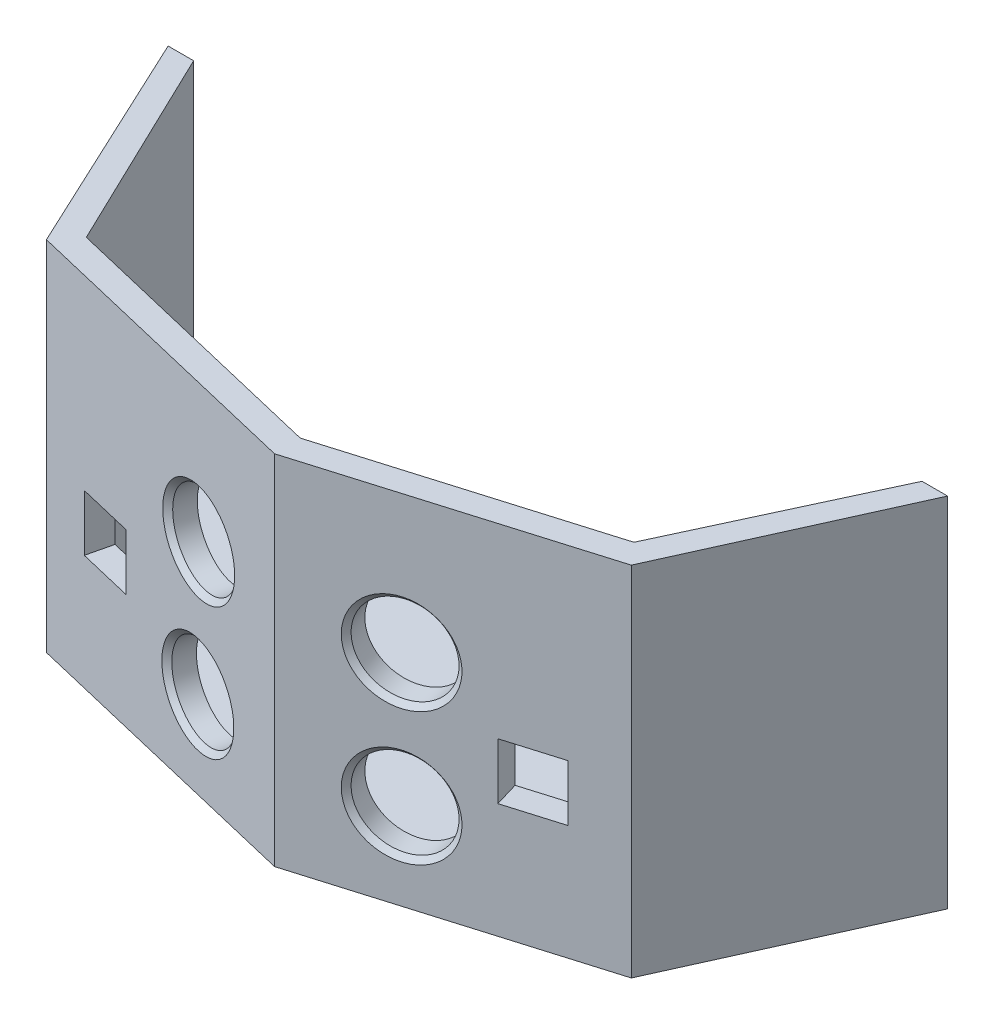
ISO-10303-21;
HEADER;
FILE_DESCRIPTION(('STEP AP214'),'2;1');
FILE_NAME('part.step','',(''),(''),'','','');
FILE_SCHEMA(('AUTOMOTIVE_DESIGN { 1 0 10303 214 1 1 1 1 }'));
ENDSEC;
DATA;
#1=APPLICATION_CONTEXT('core data for automotive mechanical design processes');
#2=APPLICATION_PROTOCOL_DEFINITION('international standard','automotive_design',2000,#1);
#3=PRODUCT_CONTEXT('',#1,'mechanical');
#4=PRODUCT('Part','Part','',(#3));
#5=PRODUCT_RELATED_PRODUCT_CATEGORY('part','',(#4));
#6=PRODUCT_DEFINITION_FORMATION('','',#4);
#7=PRODUCT_DEFINITION_CONTEXT('part definition',#1,'design');
#8=PRODUCT_DEFINITION('design','',#6,#7);
#9=PRODUCT_DEFINITION_SHAPE('','',#8);
#10=(LENGTH_UNIT() NAMED_UNIT(*) SI_UNIT(.MILLI.,.METRE.));
#11=(NAMED_UNIT(*) PLANE_ANGLE_UNIT() SI_UNIT($,.RADIAN.));
#12=(NAMED_UNIT(*) SI_UNIT($,.STERADIAN.) SOLID_ANGLE_UNIT());
#13=UNCERTAINTY_MEASURE_WITH_UNIT(LENGTH_MEASURE(1.E-05),#10,'distance_accuracy_value','');
#14=(GEOMETRIC_REPRESENTATION_CONTEXT(3) GLOBAL_UNCERTAINTY_ASSIGNED_CONTEXT((#13)) GLOBAL_UNIT_ASSIGNED_CONTEXT((#10,
#11,#12)) REPRESENTATION_CONTEXT('',''));
#15=CARTESIAN_POINT('',(0.,0.,0.));
#16=DIRECTION('',(0.,0.,1.));
#17=DIRECTION('',(1.,0.,0.));
#18=AXIS2_PLACEMENT_3D('',#15,#16,#17);
#19=CARTESIAN_POINT('',(-76.3,70.,57.7350269189626));
#20=DIRECTION('',(0.,0.,1.));
#21=DIRECTION('',(1.,0.,0.));
#22=AXIS2_PLACEMENT_3D('',#19,#20,#21);
#23=PLANE('',#22);
#24=CARTESIAN_POINT('',(0.,9.00000000000001,57.7350269189626));
#25=DIRECTION('',(0.,0.,-1.));
#26=DIRECTION('',(-1.,0.,0.));
#27=AXIS2_PLACEMENT_3D('',#24,#25,#26);
#28=CIRCLE('',#27,2.48490263839926);
#29=CARTESIAN_POINT('',(-2.48490263839926,9.00000000000001,57.7350269189626));
#30=VERTEX_POINT('',#29);
#31=EDGE_CURVE('E893',#30,#30,#28,.T.);
#32=ORIENTED_EDGE('',*,*,#31,.F.);
#33=EDGE_LOOP('',(#32));
#34=FACE_BOUND('',#33,.T.);
#35=DIRECTION('',(-1.,0.,0.));
#36=VECTOR('',#35,1.);
#37=CARTESIAN_POINT('',(-71.3,5.,57.7350269189626));
#38=LINE('',#37,#36);
#39=CARTESIAN_POINT('',(-11.3321595661992,5.,57.7350269189626));
#40=VERTEX_POINT('',#39);
#41=CARTESIAN_POINT('',(-71.3,5.,57.7350269189626));
#42=VERTEX_POINT('',#41);
#43=EDGE_CURVE('E261',#40,#42,#38,.T.);
#44=ORIENTED_EDGE('',*,*,#43,.F.);
#45=CARTESIAN_POINT('',(-11.3321595661992,8.99999999999998,57.7350269189626));
#46=DIRECTION('',(0.,0.,1.));
#47=DIRECTION('',(1.,0.,0.));
#48=AXIS2_PLACEMENT_3D('',#45,#46,#47);
#49=CIRCLE('',#48,4.);
#50=CARTESIAN_POINT('',(-7.38810637746616,8.33333333333332,57.7350269189626));
#51=VERTEX_POINT('',#50);
#52=EDGE_CURVE('E404',#40,#51,#49,.T.);
#53=ORIENTED_EDGE('',*,*,#52,.T.);
#54=CARTESIAN_POINT('',(0.500000000000002,7.,57.7350269189626));
#55=DIRECTION('',(0.,0.,1.));
#56=DIRECTION('',(1.,0.,0.));
#57=AXIS2_PLACEMENT_3D('',#54,#55,#56);
#58=CIRCLE('',#57,8.);
#59=CARTESIAN_POINT('',(0.,14.9843597113357,57.7350269189626));
#60=VERTEX_POINT('',#59);
#61=EDGE_CURVE('E383',#51,#60,#58,.F.);
#62=ORIENTED_EDGE('',*,*,#61,.T.);
#63=CARTESIAN_POINT('',(-0.499999999999999,7.,57.7350269189626));
#64=DIRECTION('',(0.,0.,1.));
#65=DIRECTION('',(1.,0.,0.));
#66=AXIS2_PLACEMENT_3D('',#63,#64,#65);
#67=CIRCLE('',#66,8.);
#68=CARTESIAN_POINT('',(7.38810637746616,8.33333333333332,57.7350269189626));
#69=VERTEX_POINT('',#68);
#70=EDGE_CURVE('E380',#60,#69,#67,.F.);
#71=ORIENTED_EDGE('',*,*,#70,.T.);
#72=CARTESIAN_POINT('',(11.3321595661992,8.99999999999998,57.7350269189626));
#73=DIRECTION('',(0.,0.,1.));
#74=DIRECTION('',(1.,0.,0.));
#75=AXIS2_PLACEMENT_3D('',#72,#73,#74);
#76=CIRCLE('',#75,4.);
#77=CARTESIAN_POINT('',(11.3321595661992,5.,57.7350269189626));
#78=VERTEX_POINT('',#77);
#79=EDGE_CURVE('E47',#69,#78,#76,.T.);
#80=ORIENTED_EDGE('',*,*,#79,.T.);
#81=CARTESIAN_POINT('',(71.3,5.,57.7350269189626));
#82=VERTEX_POINT('',#81);
#83=EDGE_CURVE('E262',#82,#78,#38,.T.);
#84=ORIENTED_EDGE('',*,*,#83,.F.);
#85=DIRECTION('',(0.,1.,0.));
#86=VECTOR('',#85,1.);
#87=CARTESIAN_POINT('',(71.3,5.,57.7350269189626));
#88=LINE('',#87,#86);
#89=CARTESIAN_POINT('',(71.3,70.,57.7350269189626));
#90=VERTEX_POINT('',#89);
#91=EDGE_CURVE('E279',#82,#90,#88,.T.);
#92=ORIENTED_EDGE('',*,*,#91,.T.);
#93=DIRECTION('',(-1.,0.,0.));
#94=VECTOR('',#93,1.);
#95=CARTESIAN_POINT('',(-76.3,70.,57.7350269189626));
#96=LINE('',#95,#94);
#97=CARTESIAN_POINT('',(76.3,70.,57.7350269189626));
#98=VERTEX_POINT('',#97);
#99=EDGE_CURVE('E288',#98,#90,#96,.T.);
#100=ORIENTED_EDGE('',*,*,#99,.F.);
#101=DIRECTION('',(0.,-1.,0.));
#102=VECTOR('',#101,1.);
#103=CARTESIAN_POINT('',(76.3,70.,57.7350269189626));
#104=LINE('',#103,#102);
#105=CARTESIAN_POINT('',(76.3,0.,57.7350269189626));
#106=VERTEX_POINT('',#105);
#107=EDGE_CURVE('E300',#98,#106,#104,.T.);
#108=ORIENTED_EDGE('',*,*,#107,.T.);
#109=DIRECTION('',(-1.,0.,0.));
#110=VECTOR('',#109,1.);
#111=CARTESIAN_POINT('',(-76.3,0.,57.7350269189626));
#112=LINE('',#111,#110);
#113=CARTESIAN_POINT('',(-76.3,0.,57.7350269189626));
#114=VERTEX_POINT('',#113);
#115=EDGE_CURVE('E278',#106,#114,#112,.T.);
#116=ORIENTED_EDGE('',*,*,#115,.T.);
#117=DIRECTION('',(0.,-1.,0.));
#118=VECTOR('',#117,1.);
#119=CARTESIAN_POINT('',(-76.3,70.,57.7350269189626));
#120=LINE('',#119,#118);
#121=CARTESIAN_POINT('',(-76.3,70.,57.7350269189626));
#122=VERTEX_POINT('',#121);
#123=EDGE_CURVE('E322',#122,#114,#120,.T.);
#124=ORIENTED_EDGE('',*,*,#123,.F.);
#125=CARTESIAN_POINT('',(-71.3,70.,57.7350269189626));
#126=VERTEX_POINT('',#125);
#127=EDGE_CURVE('E292',#126,#122,#96,.T.);
#128=ORIENTED_EDGE('',*,*,#127,.F.);
#129=DIRECTION('',(0.,1.,0.));
#130=VECTOR('',#129,1.);
#131=CARTESIAN_POINT('',(-71.3,5.,57.7350269189626));
#132=LINE('',#131,#130);
#133=EDGE_CURVE('E276',#42,#126,#132,.T.);
#134=ORIENTED_EDGE('',*,*,#133,.F.);
#135=EDGE_LOOP('',(#44,#53,#62,#71,#80,#84,#92,#100,#108,#116,#124,#128,#134));
#136=FACE_BOUND('',#135,.T.);
#137=ADVANCED_FACE('F38',(#34,#136),#23,.F.);
#138=CARTESIAN_POINT('',(-55.3740303304235,70.,102.482648944706));
#139=DIRECTION('',(0.905843488046065,0.,-0.423612529517882));
#140=DIRECTION('',(-0.423612529517882,0.,-0.905843488046065));
#141=AXIS2_PLACEMENT_3D('',#138,#139,#140);
#142=PLANE('',#141);
#143=DIRECTION('',(0.423612529517882,0.,0.905843488046065));
#144=VECTOR('',#143,1.);
#145=CARTESIAN_POINT('',(-55.3740303304235,0.,102.482648944706));
#146=LINE('',#145,#144);
#147=CARTESIAN_POINT('',(-55.3740303304235,0.,102.482648944706));
#148=VERTEX_POINT('',#147);
#149=EDGE_CURVE('E303',#114,#148,#146,.T.);
#150=ORIENTED_EDGE('',*,*,#149,.T.);
#151=DIRECTION('',(0.,-1.,0.));
#152=VECTOR('',#151,1.);
#153=CARTESIAN_POINT('',(-55.3740303304235,70.,102.482648944706));
#154=LINE('',#153,#152);
#155=CARTESIAN_POINT('',(-55.3740303304235,70.,102.482648944706));
#156=VERTEX_POINT('',#155);
#157=EDGE_CURVE('E319',#156,#148,#154,.T.);
#158=ORIENTED_EDGE('',*,*,#157,.F.);
#159=DIRECTION('',(0.423612529517882,0.,0.905843488046065));
#160=VECTOR('',#159,1.);
#161=CARTESIAN_POINT('',(-55.3740303304235,70.,102.482648944706));
#162=LINE('',#161,#160);
#163=EDGE_CURVE('E291',#122,#156,#162,.T.);
#164=ORIENTED_EDGE('',*,*,#163,.F.);
#165=ORIENTED_EDGE('',*,*,#123,.T.);
#166=EDGE_LOOP('',(#150,#158,#164,#165));
#167=FACE_BOUND('',#166,.T.);
#168=ADVANCED_FACE('F464',(#167),#142,.F.);
#169=CARTESIAN_POINT('',(-55.3740303304235,70.,102.482648944706));
#170=DIRECTION('',(0.231748268351548,0.,-0.972775791288033));
#171=DIRECTION('',(-0.972775791288033,0.,-0.231748268351548));
#172=AXIS2_PLACEMENT_3D('',#169,#170,#171);
#173=PLANE('',#172);
#174=DIRECTION('',(0.972775791288033,0.,0.231748268351548));
#175=VECTOR('',#174,1.);
#176=CARTESIAN_POINT('',(-45.6462724175432,22.5,104.800131628222));
#177=LINE('',#176,#175);
#178=CARTESIAN_POINT('',(-45.6462724175432,22.5,104.800131628221));
#179=VERTEX_POINT('',#178);
#180=CARTESIAN_POINT('',(-34.9457387133749,22.5,107.349362580089));
#181=VERTEX_POINT('',#180);
#182=EDGE_CURVE('E229',#179,#181,#177,.T.);
#183=ORIENTED_EDGE('',*,*,#182,.F.);
#184=DIRECTION('',(0.,-1.,0.));
#185=VECTOR('',#184,1.);
#186=CARTESIAN_POINT('',(-45.6462724175432,33.5,104.800131628222));
#187=LINE('',#186,#185);
#188=CARTESIAN_POINT('',(-45.6462724175432,33.5,104.800131628222));
#189=VERTEX_POINT('',#188);
#190=EDGE_CURVE('E225',#189,#179,#187,.T.);
#191=ORIENTED_EDGE('',*,*,#190,.F.);
#192=DIRECTION('',(-0.972775791288033,0.,-0.231748268351548));
#193=VECTOR('',#192,1.);
#194=CARTESIAN_POINT('',(-45.6462724175432,33.5,104.800131628222));
#195=LINE('',#194,#193);
#196=CARTESIAN_POINT('',(-34.9457387133749,33.5,107.349362580089));
#197=VERTEX_POINT('',#196);
#198=EDGE_CURVE('E235',#197,#189,#195,.T.);
#199=ORIENTED_EDGE('',*,*,#198,.F.);
#200=DIRECTION('',(0.,1.,0.));
#201=VECTOR('',#200,1.);
#202=CARTESIAN_POINT('',(-34.9457387133749,33.5,107.349362580089));
#203=LINE('',#202,#201);
#204=EDGE_CURVE('E232',#181,#197,#203,.T.);
#205=ORIENTED_EDGE('',*,*,#204,.F.);
#206=EDGE_LOOP('',(#183,#191,#199,#205));
#207=FACE_BOUND('',#206,.T.);
#208=CARTESIAN_POINT('',(-16.4629986789022,17.,111.752579678768));
#209=DIRECTION('',(0.231748268351548,0.,-0.972775791288033));
#210=DIRECTION('',(-0.972775791288033,0.,-0.231748268351548));
#211=AXIS2_PLACEMENT_3D('',#208,#209,#210);
#212=CIRCLE('',#211,9.49999999999983);
#213=CARTESIAN_POINT('',(-25.7043686961384,17.,109.550971129428));
#214=VERTEX_POINT('',#213);
#215=EDGE_CURVE('E353',#214,#214,#212,.T.);
#216=ORIENTED_EDGE('',*,*,#215,.T.);
#217=EDGE_LOOP('',(#216));
#218=FACE_BOUND('',#217,.T.);
#219=CARTESIAN_POINT('',(-16.238791744703,42.9989784073475,111.805993393643));
#220=DIRECTION('',(0.231748268351548,0.,-0.972775791288033));
#221=DIRECTION('',(-0.972775791288033,0.,-0.231748268351548));
#222=AXIS2_PLACEMENT_3D('',#219,#220,#221);
#223=CIRCLE('',#222,9.49999999999983);
#224=CARTESIAN_POINT('',(-25.4801617619391,42.9989784073475,109.604384844303));
#225=VERTEX_POINT('',#224);
#226=EDGE_CURVE('E350',#225,#225,#223,.T.);
#227=ORIENTED_EDGE('',*,*,#226,.T.);
#228=EDGE_LOOP('',(#227));
#229=FACE_BOUND('',#228,.T.);
#230=DIRECTION('',(0.972775791288033,0.,0.231748268351548));
#231=VECTOR('',#230,1.);
#232=CARTESIAN_POINT('',(-55.3740303304235,0.,102.482648944706));
#233=LINE('',#232,#231);
#234=CARTESIAN_POINT('',(3.25268607798043,0.,116.449526131067));
#235=VERTEX_POINT('',#234);
#236=EDGE_CURVE('E305',#148,#235,#233,.T.);
#237=ORIENTED_EDGE('',*,*,#236,.T.);
#238=DIRECTION('',(0.,-1.,0.));
#239=VECTOR('',#238,1.);
#240=CARTESIAN_POINT('',(3.25268607798043,70.,116.449526131067));
#241=LINE('',#240,#239);
#242=CARTESIAN_POINT('',(3.25268607798043,70.,116.449526131067));
#243=VERTEX_POINT('',#242);
#244=EDGE_CURVE('E316',#243,#235,#241,.T.);
#245=ORIENTED_EDGE('',*,*,#244,.F.);
#246=DIRECTION('',(0.972775791288033,0.,0.231748268351548));
#247=VECTOR('',#246,1.);
#248=CARTESIAN_POINT('',(-55.3740303304235,70.,102.482648944706));
#249=LINE('',#248,#247);
#250=EDGE_CURVE('E294',#156,#243,#249,.T.);
#251=ORIENTED_EDGE('',*,*,#250,.F.);
#252=ORIENTED_EDGE('',*,*,#157,.T.);
#253=EDGE_LOOP('',(#237,#245,#251,#252));
#254=FACE_BOUND('',#253,.T.);
#255=ADVANCED_FACE('F468',(#207,#218,#229,#254),#173,.F.);
#256=CARTESIAN_POINT('',(3.25268607798043,70.,116.449526131067));
#257=DIRECTION('',(-0.285688007968523,0.,-0.95832268161772));
#258=DIRECTION('',(-0.95832268161772,0.,0.285688007968523));
#259=AXIS2_PLACEMENT_3D('',#256,#257,#258);
#260=PLANE('',#259);
#261=DIRECTION('',(0.95832268161772,0.,-0.285688007968522));
#262=VECTOR('',#261,1.);
#263=CARTESIAN_POINT('',(36.9354359832066,22.5,106.408276030337));
#264=LINE('',#263,#262);
#265=CARTESIAN_POINT('',(36.9354359832064,22.5,106.408276030337));
#266=VERTEX_POINT('',#265);
#267=CARTESIAN_POINT('',(47.4769854810015,22.5,103.265707942683));
#268=VERTEX_POINT('',#267);
#269=EDGE_CURVE('E208',#266,#268,#264,.T.);
#270=ORIENTED_EDGE('',*,*,#269,.F.);
#271=DIRECTION('',(0.,-1.,0.));
#272=VECTOR('',#271,1.);
#273=CARTESIAN_POINT('',(36.9354359832066,33.5,106.408276030337));
#274=LINE('',#273,#272);
#275=CARTESIAN_POINT('',(36.9354359832066,33.5,106.408276030337));
#276=VERTEX_POINT('',#275);
#277=EDGE_CURVE('E213',#276,#266,#274,.T.);
#278=ORIENTED_EDGE('',*,*,#277,.F.);
#279=DIRECTION('',(-0.95832268161772,0.,0.285688007968522));
#280=VECTOR('',#279,1.);
#281=CARTESIAN_POINT('',(36.9354359832066,33.5,106.408276030337));
#282=LINE('',#281,#280);
#283=CARTESIAN_POINT('',(47.4769854810015,33.5,103.265707942683));
#284=VERTEX_POINT('',#283);
#285=EDGE_CURVE('E218',#284,#276,#282,.T.);
#286=ORIENTED_EDGE('',*,*,#285,.F.);
#287=DIRECTION('',(0.,1.,0.));
#288=VECTOR('',#287,1.);
#289=CARTESIAN_POINT('',(47.4769854810015,33.5,103.265707942683));
#290=LINE('',#289,#288);
#291=EDGE_CURVE('E197',#268,#284,#290,.T.);
#292=ORIENTED_EDGE('',*,*,#291,.F.);
#293=EDGE_LOOP('',(#270,#278,#286,#292));
#294=FACE_BOUND('',#293,.T.);
#295=CARTESIAN_POINT('',(22.4191397103348,17.,110.735765971696));
#296=DIRECTION('',(-0.285688007968523,0.,-0.95832268161772));
#297=DIRECTION('',(-0.95832268161772,0.,0.285688007968523));
#298=AXIS2_PLACEMENT_3D('',#295,#296,#297);
#299=CIRCLE('',#298,9.49999999999996);
#300=CARTESIAN_POINT('',(13.3150742349665,17.,113.449802047397));
#301=VERTEX_POINT('',#300);
#302=EDGE_CURVE('E341',#301,#301,#299,.T.);
#303=ORIENTED_EDGE('',*,*,#302,.T.);
#304=EDGE_LOOP('',(#303));
#305=FACE_BOUND('',#304,.T.);
#306=CARTESIAN_POINT('',(22.4191397103348,43.,110.735765971696));
#307=DIRECTION('',(-0.285688007968523,0.,-0.95832268161772));
#308=DIRECTION('',(-0.95832268161772,0.,0.285688007968523));
#309=AXIS2_PLACEMENT_3D('',#306,#307,#308);
#310=CIRCLE('',#309,9.49999999999986);
#311=CARTESIAN_POINT('',(13.3150742349666,43.,113.449802047397));
#312=VERTEX_POINT('',#311);
#313=EDGE_CURVE('E338',#312,#312,#310,.T.);
#314=ORIENTED_EDGE('',*,*,#313,.T.);
#315=EDGE_LOOP('',(#314));
#316=FACE_BOUND('',#315,.T.);
#317=DIRECTION('',(0.958322681617719,0.,-0.285688007968523));
#318=VECTOR('',#317,1.);
#319=CARTESIAN_POINT('',(3.25268607798043,0.,116.449526131067));
#320=LINE('',#319,#318);
#321=CARTESIAN_POINT('',(57.0602122971787,0.,100.408827862998));
#322=VERTEX_POINT('',#321);
#323=EDGE_CURVE('E307',#235,#322,#320,.T.);
#324=ORIENTED_EDGE('',*,*,#323,.T.);
#325=DIRECTION('',(0.,-1.,0.));
#326=VECTOR('',#325,1.);
#327=CARTESIAN_POINT('',(57.0602122971787,70.,100.408827862998));
#328=LINE('',#327,#326);
#329=CARTESIAN_POINT('',(57.0602122971787,70.,100.408827862998));
#330=VERTEX_POINT('',#329);
#331=EDGE_CURVE('E313',#330,#322,#328,.T.);
#332=ORIENTED_EDGE('',*,*,#331,.F.);
#333=DIRECTION('',(0.958322681617719,0.,-0.285688007968523));
#334=VECTOR('',#333,1.);
#335=CARTESIAN_POINT('',(3.25268607798043,70.,116.449526131067));
#336=LINE('',#335,#334);
#337=EDGE_CURVE('E296',#243,#330,#336,.T.);
#338=ORIENTED_EDGE('',*,*,#337,.F.);
#339=ORIENTED_EDGE('',*,*,#244,.T.);
#340=EDGE_LOOP('',(#324,#332,#338,#339));
#341=FACE_BOUND('',#340,.T.);
#342=ADVANCED_FACE('F215',(#294,#305,#316,#341),#260,.F.);
#343=CARTESIAN_POINT('',(57.0602122971787,70.,100.408827862998));
#344=DIRECTION('',(-0.911628861418138,0.,-0.411014378129853));
#345=DIRECTION('',(-0.411014378129853,0.,0.911628861418138));
#346=AXIS2_PLACEMENT_3D('',#343,#344,#345);
#347=PLANE('',#346);
#348=DIRECTION('',(0.411014378129853,0.,-0.911628861418138));
#349=VECTOR('',#348,1.);
#350=CARTESIAN_POINT('',(57.0602122971787,0.,100.408827862998));
#351=LINE('',#350,#349);
#352=EDGE_CURVE('E309',#322,#106,#351,.T.);
#353=ORIENTED_EDGE('',*,*,#352,.T.);
#354=ORIENTED_EDGE('',*,*,#107,.F.);
#355=DIRECTION('',(0.411014378129853,0.,-0.911628861418138));
#356=VECTOR('',#355,1.);
#357=CARTESIAN_POINT('',(57.0602122971787,70.,100.408827862998));
#358=LINE('',#357,#356);
#359=EDGE_CURVE('E298',#330,#98,#358,.T.);
#360=ORIENTED_EDGE('',*,*,#359,.F.);
#361=ORIENTED_EDGE('',*,*,#331,.T.);
#362=EDGE_LOOP('',(#353,#354,#360,#361));
#363=FACE_BOUND('',#362,.T.);
#364=ADVANCED_FACE('F455',(#363),#347,.F.);
#365=CARTESIAN_POINT('',(0.,70.,0.));
#366=DIRECTION('',(0.,1.,0.));
#367=DIRECTION('',(0.,0.,1.));
#368=AXIS2_PLACEMENT_3D('',#365,#366,#367);
#369=PLANE('',#368);
#370=DIRECTION('',(0.433093550106812,0.,0.901348976177306));
#371=VECTOR('',#370,1.);
#372=CARTESIAN_POINT('',(-51.8672905810189,70.,98.1781430420955));
#373=LINE('',#372,#371);
#374=CARTESIAN_POINT('',(-51.8672905810189,70.,98.1781430420955));
#375=VERTEX_POINT('',#374);
#376=EDGE_CURVE('E266',#126,#375,#373,.T.);
#377=ORIENTED_EDGE('',*,*,#376,.F.);
#378=ORIENTED_EDGE('',*,*,#127,.T.);
#379=ORIENTED_EDGE('',*,*,#163,.T.);
#380=ORIENTED_EDGE('',*,*,#250,.T.);
#381=ORIENTED_EDGE('',*,*,#337,.T.);
#382=ORIENTED_EDGE('',*,*,#359,.T.);
#383=ORIENTED_EDGE('',*,*,#99,.T.);
#384=DIRECTION('',(0.42047619198709,0.,-0.907303572114668));
#385=VECTOR('',#384,1.);
#386=CARTESIAN_POINT('',(53.4414666896094,70.,96.2701720092788));
#387=LINE('',#386,#385);
#388=CARTESIAN_POINT('',(53.4414666896094,70.,96.2701720092788));
#389=VERTEX_POINT('',#388);
#390=EDGE_CURVE('E252',#389,#90,#387,.T.);
#391=ORIENTED_EDGE('',*,*,#390,.F.);
#392=DIRECTION('',(0.958322681617719,0.,-0.285688007968523));
#393=VECTOR('',#392,1.);
#394=CARTESIAN_POINT('',(3.10815498127732,70.,111.275163367866));
#395=LINE('',#394,#393);
#396=CARTESIAN_POINT('',(3.10815498127732,70.,111.275163367866));
#397=VERTEX_POINT('',#396);
#398=EDGE_CURVE('E272',#397,#389,#395,.T.);
#399=ORIENTED_EDGE('',*,*,#398,.F.);
#400=DIRECTION('',(0.972775791288033,0.,0.231748268351548));
#401=VECTOR('',#400,1.);
#402=CARTESIAN_POINT('',(-51.8672905810189,70.,98.1781430420955));
#403=LINE('',#402,#401);
#404=EDGE_CURVE('E268',#375,#397,#403,.T.);
#405=ORIENTED_EDGE('',*,*,#404,.F.);
#406=EDGE_LOOP('',(#377,#378,#379,#380,#381,#382,#383,#391,#399,#405));
#407=FACE_BOUND('',#406,.T.);
#408=ADVANCED_FACE('F437',(#407),#369,.T.);
#409=CARTESIAN_POINT('',(0.,0.,0.));
#410=DIRECTION('',(0.,1.,0.));
#411=DIRECTION('',(0.,0.,1.));
#412=AXIS2_PLACEMENT_3D('',#409,#410,#411);
#413=PLANE('',#412);
#414=ORIENTED_EDGE('',*,*,#115,.F.);
#415=ORIENTED_EDGE('',*,*,#352,.F.);
#416=ORIENTED_EDGE('',*,*,#323,.F.);
#417=ORIENTED_EDGE('',*,*,#236,.F.);
#418=ORIENTED_EDGE('',*,*,#149,.F.);
#419=EDGE_LOOP('',(#414,#415,#416,#417,#418));
#420=FACE_BOUND('',#419,.T.);
#421=ADVANCED_FACE('F459',(#420),#413,.F.);
#422=CARTESIAN_POINT('',(-51.8672905810189,5.,98.1781430420955));
#423=DIRECTION('',(-0.901348976177306,0.,0.433093550106812));
#424=DIRECTION('',(0.433093550106812,0.,0.901348976177306));
#425=AXIS2_PLACEMENT_3D('',#422,#423,#424);
#426=PLANE('',#425);
#427=ORIENTED_EDGE('',*,*,#376,.T.);
#428=DIRECTION('',(0.,1.,0.));
#429=VECTOR('',#428,1.);
#430=CARTESIAN_POINT('',(-51.8672905810189,5.,98.1781430420955));
#431=LINE('',#430,#429);
#432=CARTESIAN_POINT('',(-51.8672905810189,5.,98.1781430420955));
#433=VERTEX_POINT('',#432);
#434=EDGE_CURVE('E265',#433,#375,#431,.T.);
#435=ORIENTED_EDGE('',*,*,#434,.F.);
#436=DIRECTION('',(0.433093550106812,0.,0.901348976177306));
#437=VECTOR('',#436,1.);
#438=CARTESIAN_POINT('',(-51.8672905810189,5.,98.1781430420955));
#439=LINE('',#438,#437);
#440=EDGE_CURVE('E248',#42,#433,#439,.T.);
#441=ORIENTED_EDGE('',*,*,#440,.F.);
#442=ORIENTED_EDGE('',*,*,#133,.T.);
#443=EDGE_LOOP('',(#427,#435,#441,#442));
#444=FACE_BOUND('',#443,.T.);
#445=ADVANCED_FACE('F434',(#444),#426,.F.);
#446=CARTESIAN_POINT('',(53.4414666896094,5.,96.2701720092788));
#447=DIRECTION('',(0.907303572114667,0.,0.42047619198709));
#448=DIRECTION('',(0.42047619198709,0.,-0.907303572114668));
#449=AXIS2_PLACEMENT_3D('',#446,#447,#448);
#450=PLANE('',#449);
#451=ORIENTED_EDGE('',*,*,#390,.T.);
#452=ORIENTED_EDGE('',*,*,#91,.F.);
#453=DIRECTION('',(0.42047619198709,0.,-0.907303572114668));
#454=VECTOR('',#453,1.);
#455=CARTESIAN_POINT('',(53.4414666896094,5.,96.2701720092788));
#456=LINE('',#455,#454);
#457=CARTESIAN_POINT('',(53.4414666896094,5.,96.2701720092788));
#458=VERTEX_POINT('',#457);
#459=EDGE_CURVE('E258',#458,#82,#456,.T.);
#460=ORIENTED_EDGE('',*,*,#459,.F.);
#461=DIRECTION('',(0.,1.,0.));
#462=VECTOR('',#461,1.);
#463=CARTESIAN_POINT('',(53.4414666896094,5.,96.2701720092788));
#464=LINE('',#463,#462);
#465=EDGE_CURVE('E282',#458,#389,#464,.T.);
#466=ORIENTED_EDGE('',*,*,#465,.T.);
#467=EDGE_LOOP('',(#451,#452,#460,#466));
#468=FACE_BOUND('',#467,.T.);
#469=ADVANCED_FACE('F448',(#468),#450,.F.);
#470=CARTESIAN_POINT('',(3.10815498127732,5.,111.275163367866));
#471=DIRECTION('',(0.285688007968523,0.,0.958322681617719));
#472=DIRECTION('',(0.958322681617719,0.,-0.285688007968523));
#473=AXIS2_PLACEMENT_3D('',#470,#471,#472);
#474=PLANE('',#473);
#475=DIRECTION('',(-0.958322681617719,0.,0.285688007968523));
#476=VECTOR('',#475,1.);
#477=CARTESIAN_POINT('',(3.10815498127732,33.5,111.275163367866));
#478=LINE('',#477,#476);
#479=CARTESIAN_POINT('',(46.0485454411589,33.5,98.4740945345942));
#480=VERTEX_POINT('',#479);
#481=CARTESIAN_POINT('',(35.506995943364,33.5,101.616662622248));
#482=VERTEX_POINT('',#481);
#483=EDGE_CURVE('E374',#480,#482,#478,.T.);
#484=ORIENTED_EDGE('',*,*,#483,.T.);
#485=DIRECTION('',(0.,-1.,0.));
#486=VECTOR('',#485,1.);
#487=CARTESIAN_POINT('',(35.506995943364,5.,101.616662622248));
#488=LINE('',#487,#486);
#489=CARTESIAN_POINT('',(35.506995943364,22.5,101.616662622248));
#490=VERTEX_POINT('',#489);
#491=EDGE_CURVE('E377',#482,#490,#488,.T.);
#492=ORIENTED_EDGE('',*,*,#491,.T.);
#493=DIRECTION('',(0.958322681617719,0.,-0.285688007968523));
#494=VECTOR('',#493,1.);
#495=CARTESIAN_POINT('',(3.10815498127732,22.5,111.275163367866));
#496=LINE('',#495,#494);
#497=CARTESIAN_POINT('',(46.0485454411589,22.5,98.4740945345942));
#498=VERTEX_POINT('',#497);
#499=EDGE_CURVE('E371',#490,#498,#496,.T.);
#500=ORIENTED_EDGE('',*,*,#499,.T.);
#501=DIRECTION('',(0.,1.,0.));
#502=VECTOR('',#501,1.);
#503=CARTESIAN_POINT('',(46.0485454411589,5.,98.4740945345942));
#504=LINE('',#503,#502);
#505=EDGE_CURVE('E200',#498,#480,#504,.T.);
#506=ORIENTED_EDGE('',*,*,#505,.T.);
#507=EDGE_LOOP('',(#484,#492,#500,#506));
#508=FACE_BOUND('',#507,.T.);
#509=CARTESIAN_POINT('',(20.9906996704922,17.,105.944152563608));
#510=DIRECTION('',(0.285688007968523,0.,0.958322681617719));
#511=DIRECTION('',(0.958322681617719,0.,-0.285688007968523));
#512=AXIS2_PLACEMENT_3D('',#509,#510,#511);
#513=CIRCLE('',#512,8.5);
#514=CARTESIAN_POINT('',(29.1364424642428,17.,103.515804495875));
#515=VERTEX_POINT('',#514);
#516=EDGE_CURVE('E329',#515,#515,#513,.T.);
#517=ORIENTED_EDGE('',*,*,#516,.T.);
#518=EDGE_LOOP('',(#517));
#519=FACE_BOUND('',#518,.T.);
#520=CARTESIAN_POINT('',(20.9906996704922,43.,105.944152563608));
#521=DIRECTION('',(0.285688007968523,0.,0.958322681617719));
#522=DIRECTION('',(0.958322681617719,0.,-0.285688007968523));
#523=AXIS2_PLACEMENT_3D('',#520,#521,#522);
#524=CIRCLE('',#523,8.5);
#525=CARTESIAN_POINT('',(29.1364424642428,43.,103.515804495875));
#526=VERTEX_POINT('',#525);
#527=EDGE_CURVE('E241',#526,#526,#524,.T.);
#528=ORIENTED_EDGE('',*,*,#527,.T.);
#529=EDGE_LOOP('',(#528));
#530=FACE_BOUND('',#529,.T.);
#531=ORIENTED_EDGE('',*,*,#398,.T.);
#532=ORIENTED_EDGE('',*,*,#465,.F.);
#533=DIRECTION('',(0.958322681617719,0.,-0.285688007968523));
#534=VECTOR('',#533,1.);
#535=CARTESIAN_POINT('',(3.10815498127732,5.,111.275163367866));
#536=LINE('',#535,#534);
#537=CARTESIAN_POINT('',(3.10815498127732,5.,111.275163367866));
#538=VERTEX_POINT('',#537);
#539=EDGE_CURVE('E255',#538,#458,#536,.T.);
#540=ORIENTED_EDGE('',*,*,#539,.F.);
#541=DIRECTION('',(0.,1.,0.));
#542=VECTOR('',#541,1.);
#543=CARTESIAN_POINT('',(3.10815498127732,5.,111.275163367866));
#544=LINE('',#543,#542);
#545=EDGE_CURVE('E284',#538,#397,#544,.T.);
#546=ORIENTED_EDGE('',*,*,#545,.T.);
#547=EDGE_LOOP('',(#531,#532,#540,#546));
#548=FACE_BOUND('',#547,.T.);
#549=ADVANCED_FACE('F446',(#508,#519,#530,#548),#474,.F.);
#550=CARTESIAN_POINT('',(-51.8672905810189,5.,98.1781430420955));
#551=DIRECTION('',(-0.231748268351548,0.,0.972775791288033));
#552=DIRECTION('',(0.972775791288033,0.,0.231748268351548));
#553=AXIS2_PLACEMENT_3D('',#550,#551,#552);
#554=PLANE('',#553);
#555=DIRECTION('',(-0.972775791288033,0.,-0.231748268351548));
#556=VECTOR('',#555,1.);
#557=CARTESIAN_POINT('',(-51.8672905810189,33.5,98.1781430420955));
#558=LINE('',#557,#556);
#559=CARTESIAN_POINT('',(-33.7869973716171,33.5,102.485483623648));
#560=VERTEX_POINT('',#559);
#561=CARTESIAN_POINT('',(-44.4875310757855,33.5,99.9362526717813));
#562=VERTEX_POINT('',#561);
#563=EDGE_CURVE('E365',#560,#562,#558,.T.);
#564=ORIENTED_EDGE('',*,*,#563,.T.);
#565=DIRECTION('',(0.,-1.,0.));
#566=VECTOR('',#565,1.);
#567=CARTESIAN_POINT('',(-44.4875310757855,5.,99.9362526717813));
#568=LINE('',#567,#566);
#569=CARTESIAN_POINT('',(-44.4875310757855,22.5,99.9362526717813));
#570=VERTEX_POINT('',#569);
#571=EDGE_CURVE('E368',#562,#570,#568,.T.);
#572=ORIENTED_EDGE('',*,*,#571,.T.);
#573=DIRECTION('',(0.972775791288033,0.,0.231748268351548));
#574=VECTOR('',#573,1.);
#575=CARTESIAN_POINT('',(-51.8672905810189,22.5,98.1781430420955));
#576=LINE('',#575,#574);
#577=CARTESIAN_POINT('',(-33.7869973716171,22.5,102.485483623648));
#578=VERTEX_POINT('',#577);
#579=EDGE_CURVE('E359',#570,#578,#576,.T.);
#580=ORIENTED_EDGE('',*,*,#579,.T.);
#581=DIRECTION('',(0.,1.,0.));
#582=VECTOR('',#581,1.);
#583=CARTESIAN_POINT('',(-33.7869973716171,5.,102.485483623648));
#584=LINE('',#583,#582);
#585=EDGE_CURVE('E362',#578,#560,#584,.T.);
#586=ORIENTED_EDGE('',*,*,#585,.T.);
#587=EDGE_LOOP('',(#564,#572,#580,#586));
#588=FACE_BOUND('',#587,.T.);
#589=CARTESIAN_POINT('',(-15.0800504029452,42.9989784073475,106.942114437203));
#590=DIRECTION('',(-0.231748268351548,0.,0.972775791288033));
#591=DIRECTION('',(0.972775791288033,0.,0.231748268351548));
#592=AXIS2_PLACEMENT_3D('',#589,#590,#591);
#593=CIRCLE('',#592,8.5);
#594=CARTESIAN_POINT('',(-6.81145617699696,42.9989784073475,108.911974718191));
#595=VERTEX_POINT('',#594);
#596=EDGE_CURVE('E269',#595,#595,#593,.T.);
#597=ORIENTED_EDGE('',*,*,#596,.T.);
#598=EDGE_LOOP('',(#597));
#599=FACE_BOUND('',#598,.T.);
#600=CARTESIAN_POINT('',(-15.3042573371445,17.,106.888700722328));
#601=DIRECTION('',(-0.231748268351548,0.,0.972775791288033));
#602=DIRECTION('',(0.972775791288033,0.,0.231748268351548));
#603=AXIS2_PLACEMENT_3D('',#600,#601,#602);
#604=CIRCLE('',#603,8.5);
#605=CARTESIAN_POINT('',(-7.03566311119619,17.,108.858561003316));
#606=VERTEX_POINT('',#605);
#607=EDGE_CURVE('E326',#606,#606,#604,.T.);
#608=ORIENTED_EDGE('',*,*,#607,.T.);
#609=EDGE_LOOP('',(#608));
#610=FACE_BOUND('',#609,.T.);
#611=ORIENTED_EDGE('',*,*,#404,.T.);
#612=ORIENTED_EDGE('',*,*,#545,.F.);
#613=DIRECTION('',(0.972775791288033,0.,0.231748268351548));
#614=VECTOR('',#613,1.);
#615=CARTESIAN_POINT('',(-51.8672905810189,5.,98.1781430420955));
#616=LINE('',#615,#614);
#617=EDGE_CURVE('E251',#433,#538,#616,.T.);
#618=ORIENTED_EDGE('',*,*,#617,.F.);
#619=ORIENTED_EDGE('',*,*,#434,.T.);
#620=EDGE_LOOP('',(#611,#612,#618,#619));
#621=FACE_BOUND('',#620,.T.);
#622=ADVANCED_FACE('F442',(#588,#599,#610,#621),#554,.F.);
#623=CARTESIAN_POINT('',(0.,4.99999999999998,0.));
#624=DIRECTION('',(0.,-1.,0.));
#625=DIRECTION('',(0.,0.,-1.));
#626=AXIS2_PLACEMENT_3D('',#623,#624,#625);
#627=PLANE('',#626);
#628=DIRECTION('',(-1.,0.,0.));
#629=VECTOR('',#628,1.);
#630=CARTESIAN_POINT('',(7.5,5.,63.7350269189626));
#631=LINE('',#630,#629);
#632=CARTESIAN_POINT('',(11.3321595661992,5.,63.7350269189626));
#633=VERTEX_POINT('',#632);
#634=CARTESIAN_POINT('',(-11.3321595661992,5.,63.7350269189626));
#635=VERTEX_POINT('',#634);
#636=EDGE_CURVE('E394',#633,#635,#631,.T.);
#637=ORIENTED_EDGE('',*,*,#636,.T.);
#638=DIRECTION('',(0.,0.,-1.));
#639=VECTOR('',#638,1.);
#640=CARTESIAN_POINT('',(-11.3321595661992,4.99999999999998,0.));
#641=LINE('',#640,#639);
#642=EDGE_CURVE('E397',#635,#40,#641,.T.);
#643=ORIENTED_EDGE('',*,*,#642,.T.);
#644=ORIENTED_EDGE('',*,*,#43,.T.);
#645=ORIENTED_EDGE('',*,*,#440,.T.);
#646=ORIENTED_EDGE('',*,*,#617,.T.);
#647=ORIENTED_EDGE('',*,*,#539,.T.);
#648=ORIENTED_EDGE('',*,*,#459,.T.);
#649=ORIENTED_EDGE('',*,*,#83,.T.);
#650=DIRECTION('',(0.,0.,-1.));
#651=VECTOR('',#650,1.);
#652=CARTESIAN_POINT('',(11.3321595661992,4.99999999999998,0.));
#653=LINE('',#652,#651);
#654=EDGE_CURVE('E390',#78,#633,#653,.F.);
#655=ORIENTED_EDGE('',*,*,#654,.T.);
#656=EDGE_LOOP('',(#637,#643,#644,#645,#646,#647,#648,#649,#655));
#657=FACE_BOUND('',#656,.T.);
#658=ADVANCED_FACE('F414',(#657),#627,.F.);
#659=CARTESIAN_POINT('',(-14.1455159953868,17.,102.024821765888));
#660=DIRECTION('',(-0.231748268351548,0.,0.972775791288033));
#661=DIRECTION('',(0.972775791288033,0.,0.231748268351548));
#662=AXIS2_PLACEMENT_3D('',#659,#660,#661);
#663=CYLINDRICAL_SURFACE('',#662,8.5);
#664=CARTESIAN_POINT('',(-16.2312504105507,17.,110.77980388748));
#665=DIRECTION('',(0.231748268351549,0.,-0.972775791288033));
#666=DIRECTION('',(-0.972775791288033,0.,-0.231748268351549));
#667=AXIS2_PLACEMENT_3D('',#664,#665,#666);
#668=CIRCLE('',#667,8.5);
#669=CARTESIAN_POINT('',(-24.499844636499,17.,108.809943606492));
#670=VERTEX_POINT('',#669);
#671=EDGE_CURVE('E347',#670,#670,#668,.F.);
#672=ORIENTED_EDGE('',*,*,#671,.T.);
#673=EDGE_LOOP('',(#672));
#674=FACE_BOUND('',#673,.T.);
#675=ORIENTED_EDGE('',*,*,#607,.F.);
#676=EDGE_LOOP('',(#675));
#677=FACE_BOUND('',#676,.T.);
#678=ADVANCED_FACE('F577',(#674,#677),#663,.F.);
#679=CARTESIAN_POINT('',(-13.9213090611875,42.9989784073475,102.078235480763));
#680=DIRECTION('',(-0.231748268351548,0.,0.972775791288033));
#681=DIRECTION('',(0.972775791288033,0.,0.231748268351548));
#682=AXIS2_PLACEMENT_3D('',#679,#680,#681);
#683=CYLINDRICAL_SURFACE('',#682,8.5);
#684=CARTESIAN_POINT('',(-16.0070434763515,42.9989784073475,110.833217602355));
#685=DIRECTION('',(0.231748268351549,0.,-0.972775791288033));
#686=DIRECTION('',(-0.972775791288033,0.,-0.231748268351549));
#687=AXIS2_PLACEMENT_3D('',#684,#685,#686);
#688=CIRCLE('',#687,8.5);
#689=CARTESIAN_POINT('',(-24.2756377022998,42.9989784073475,108.863357321367));
#690=VERTEX_POINT('',#689);
#691=EDGE_CURVE('E356',#690,#690,#688,.F.);
#692=ORIENTED_EDGE('',*,*,#691,.T.);
#693=EDGE_LOOP('',(#692));
#694=FACE_BOUND('',#693,.T.);
#695=ORIENTED_EDGE('',*,*,#596,.F.);
#696=EDGE_LOOP('',(#695));
#697=FACE_BOUND('',#696,.T.);
#698=ADVANCED_FACE('F573',(#694,#697),#683,.F.);
#699=CARTESIAN_POINT('',(19.5622596306496,43.,101.152539155519));
#700=DIRECTION('',(0.285688007968523,0.,0.95832268161772));
#701=DIRECTION('',(0.95832268161772,0.,-0.285688007968523));
#702=AXIS2_PLACEMENT_3D('',#699,#700,#701);
#703=CYLINDRICAL_SURFACE('',#702,8.5);
#704=CARTESIAN_POINT('',(22.1334517023663,43.,109.777443290079));
#705=DIRECTION('',(-0.285688007968524,0.,-0.958322681617719));
#706=DIRECTION('',(-0.958322681617719,0.,0.285688007968524));
#707=AXIS2_PLACEMENT_3D('',#704,#705,#706);
#708=CIRCLE('',#707,8.5);
#709=CARTESIAN_POINT('',(13.9877089086157,43.,112.205791357811));
#710=VERTEX_POINT('',#709);
#711=EDGE_CURVE('E344',#710,#710,#708,.F.);
#712=ORIENTED_EDGE('',*,*,#711,.T.);
#713=EDGE_LOOP('',(#712));
#714=FACE_BOUND('',#713,.T.);
#715=ORIENTED_EDGE('',*,*,#527,.F.);
#716=EDGE_LOOP('',(#715));
#717=FACE_BOUND('',#716,.T.);
#718=ADVANCED_FACE('F569',(#714,#717),#703,.F.);
#719=CARTESIAN_POINT('',(19.5622596306496,17.,101.152539155519));
#720=DIRECTION('',(0.285688007968523,0.,0.95832268161772));
#721=DIRECTION('',(0.95832268161772,0.,-0.285688007968523));
#722=AXIS2_PLACEMENT_3D('',#719,#720,#721);
#723=CYLINDRICAL_SURFACE('',#722,8.5);
#724=CARTESIAN_POINT('',(22.1334517023663,17.,109.777443290079));
#725=DIRECTION('',(-0.285688007968524,0.,-0.958322681617719));
#726=DIRECTION('',(-0.958322681617719,0.,0.285688007968524));
#727=AXIS2_PLACEMENT_3D('',#724,#725,#726);
#728=CIRCLE('',#727,8.5);
#729=CARTESIAN_POINT('',(13.9877089086157,17.,112.205791357811));
#730=VERTEX_POINT('',#729);
#731=EDGE_CURVE('E325',#730,#730,#728,.F.);
#732=ORIENTED_EDGE('',*,*,#731,.T.);
#733=EDGE_LOOP('',(#732));
#734=FACE_BOUND('',#733,.T.);
#735=ORIENTED_EDGE('',*,*,#516,.F.);
#736=EDGE_LOOP('',(#735));
#737=FACE_BOUND('',#736,.T.);
#738=ADVANCED_FACE('F496',(#734,#737),#723,.F.);
#739=CARTESIAN_POINT('',(22.1334517023663,17.,109.777443290079));
#740=DIRECTION('',(0.285688007968524,0.,0.958322681617719));
#741=DIRECTION('',(0.958322681617719,0.,-0.285688007968524));
#742=AXIS2_PLACEMENT_3D('',#739,#740,#741);
#743=CONICAL_SURFACE('',#742,8.5,0.785398163397457);
#744=ORIENTED_EDGE('',*,*,#302,.F.);
#745=EDGE_LOOP('',(#744));
#746=FACE_BOUND('',#745,.T.);
#747=ORIENTED_EDGE('',*,*,#731,.F.);
#748=EDGE_LOOP('',(#747));
#749=FACE_BOUND('',#748,.T.);
#750=ADVANCED_FACE('F489',(#746,#749),#743,.F.);
#751=CARTESIAN_POINT('',(22.1334517023663,43.,109.777443290079));
#752=DIRECTION('',(0.285688007968524,0.,0.958322681617719));
#753=DIRECTION('',(0.958322681617719,0.,-0.285688007968524));
#754=AXIS2_PLACEMENT_3D('',#751,#752,#753);
#755=CONICAL_SURFACE('',#754,8.5,0.785398163397441);
#756=ORIENTED_EDGE('',*,*,#313,.F.);
#757=EDGE_LOOP('',(#756));
#758=FACE_BOUND('',#757,.T.);
#759=ORIENTED_EDGE('',*,*,#711,.F.);
#760=EDGE_LOOP('',(#759));
#761=FACE_BOUND('',#760,.T.);
#762=ADVANCED_FACE('F495',(#758,#761),#755,.F.);
#763=CARTESIAN_POINT('',(-16.2312504105507,17.,110.77980388748));
#764=DIRECTION('',(-0.231748268351549,0.,0.972775791288033));
#765=DIRECTION('',(0.972775791288033,0.,0.231748268351549));
#766=AXIS2_PLACEMENT_3D('',#763,#764,#765);
#767=CONICAL_SURFACE('',#766,8.5,0.785398163397445);
#768=ORIENTED_EDGE('',*,*,#215,.F.);
#769=EDGE_LOOP('',(#768));
#770=FACE_BOUND('',#769,.T.);
#771=ORIENTED_EDGE('',*,*,#671,.F.);
#772=EDGE_LOOP('',(#771));
#773=FACE_BOUND('',#772,.T.);
#774=ADVANCED_FACE('F503',(#770,#773),#767,.F.);
#775=CARTESIAN_POINT('',(-16.0070434763515,42.9989784073475,110.833217602355));
#776=DIRECTION('',(-0.231748268351549,0.,0.972775791288033));
#777=DIRECTION('',(0.972775791288033,0.,0.231748268351549));
#778=AXIS2_PLACEMENT_3D('',#775,#776,#777);
#779=CONICAL_SURFACE('',#778,8.5,0.785398163397445);
#780=ORIENTED_EDGE('',*,*,#226,.F.);
#781=EDGE_LOOP('',(#780));
#782=FACE_BOUND('',#781,.T.);
#783=ORIENTED_EDGE('',*,*,#691,.F.);
#784=EDGE_LOOP('',(#783));
#785=FACE_BOUND('',#784,.T.);
#786=ADVANCED_FACE('F510',(#782,#785),#779,.F.);
#787=CARTESIAN_POINT('',(-43.3287897340278,33.5,95.0723737153412));
#788=DIRECTION('',(-0.972775791288033,0.,-0.231748268351548));
#789=DIRECTION('',(-0.231748268351548,0.,0.972775791288033));
#790=AXIS2_PLACEMENT_3D('',#787,#788,#789);
#791=PLANE('',#790);
#792=DIRECTION('',(-0.231748268351548,0.,0.972775791288033));
#793=VECTOR('',#792,1.);
#794=CARTESIAN_POINT('',(-43.3287897340278,33.5,95.0723737153412));
#795=LINE('',#794,#793);
#796=EDGE_CURVE('E239',#562,#189,#795,.T.);
#797=ORIENTED_EDGE('',*,*,#796,.T.);
#798=ORIENTED_EDGE('',*,*,#190,.T.);
#799=DIRECTION('',(-0.231748268351548,0.,0.972775791288033));
#800=VECTOR('',#799,1.);
#801=CARTESIAN_POINT('',(-43.3287897340278,22.5,95.0723737153412));
#802=LINE('',#801,#800);
#803=EDGE_CURVE('E238',#570,#179,#802,.T.);
#804=ORIENTED_EDGE('',*,*,#803,.F.);
#805=ORIENTED_EDGE('',*,*,#571,.F.);
#806=EDGE_LOOP('',(#797,#798,#804,#805));
#807=FACE_BOUND('',#806,.T.);
#808=ADVANCED_FACE('F516',(#807),#791,.F.);
#809=CARTESIAN_POINT('',(-43.3287897340278,33.5,95.0723737153412));
#810=DIRECTION('',(0.,1.,0.));
#811=DIRECTION('',(0.,0.,1.));
#812=AXIS2_PLACEMENT_3D('',#809,#810,#811);
#813=PLANE('',#812);
#814=DIRECTION('',(-0.231748268351548,0.,0.972775791288033));
#815=VECTOR('',#814,1.);
#816=CARTESIAN_POINT('',(-32.6282560298594,33.5,97.6216046672083));
#817=LINE('',#816,#815);
#818=EDGE_CURVE('E242',#560,#197,#817,.T.);
#819=ORIENTED_EDGE('',*,*,#818,.T.);
#820=ORIENTED_EDGE('',*,*,#198,.T.);
#821=ORIENTED_EDGE('',*,*,#796,.F.);
#822=ORIENTED_EDGE('',*,*,#563,.F.);
#823=EDGE_LOOP('',(#819,#820,#821,#822));
#824=FACE_BOUND('',#823,.T.);
#825=ADVANCED_FACE('F553',(#824),#813,.F.);
#826=CARTESIAN_POINT('',(-32.6282560298594,33.5,97.6216046672083));
#827=DIRECTION('',(0.972775791288033,0.,0.231748268351548));
#828=DIRECTION('',(0.231748268351548,0.,-0.972775791288033));
#829=AXIS2_PLACEMENT_3D('',#826,#827,#828);
#830=PLANE('',#829);
#831=DIRECTION('',(-0.231748268351548,0.,0.972775791288033));
#832=VECTOR('',#831,1.);
#833=CARTESIAN_POINT('',(-32.6282560298594,22.5,97.6216046672083));
#834=LINE('',#833,#832);
#835=EDGE_CURVE('E244',#578,#181,#834,.T.);
#836=ORIENTED_EDGE('',*,*,#835,.T.);
#837=ORIENTED_EDGE('',*,*,#204,.T.);
#838=ORIENTED_EDGE('',*,*,#818,.F.);
#839=ORIENTED_EDGE('',*,*,#585,.F.);
#840=EDGE_LOOP('',(#836,#837,#838,#839));
#841=FACE_BOUND('',#840,.T.);
#842=ADVANCED_FACE('F556',(#841),#830,.F.);
#843=CARTESIAN_POINT('',(-43.3287897340278,22.5,95.0723737153412));
#844=DIRECTION('',(0.,-1.,0.));
#845=DIRECTION('',(0.,0.,-1.));
#846=AXIS2_PLACEMENT_3D('',#843,#844,#845);
#847=PLANE('',#846);
#848=ORIENTED_EDGE('',*,*,#803,.T.);
#849=ORIENTED_EDGE('',*,*,#182,.T.);
#850=ORIENTED_EDGE('',*,*,#835,.F.);
#851=ORIENTED_EDGE('',*,*,#579,.F.);
#852=EDGE_LOOP('',(#848,#849,#850,#851));
#853=FACE_BOUND('',#852,.T.);
#854=ADVANCED_FACE('F551',(#853),#847,.F.);
#855=CARTESIAN_POINT('',(34.0785559035214,33.5,96.8250492141594));
#856=DIRECTION('',(-0.95832268161772,0.,0.285688007968523));
#857=DIRECTION('',(0.285688007968523,0.,0.95832268161772));
#858=AXIS2_PLACEMENT_3D('',#855,#856,#857);
#859=PLANE('',#858);
#860=DIRECTION('',(0.285688007968523,0.,0.95832268161772));
#861=VECTOR('',#860,1.);
#862=CARTESIAN_POINT('',(34.0785559035214,33.5,96.8250492141594));
#863=LINE('',#862,#861);
#864=EDGE_CURVE('E223',#482,#276,#863,.T.);
#865=ORIENTED_EDGE('',*,*,#864,.T.);
#866=ORIENTED_EDGE('',*,*,#277,.T.);
#867=DIRECTION('',(0.285688007968523,0.,0.95832268161772));
#868=VECTOR('',#867,1.);
#869=CARTESIAN_POINT('',(34.0785559035214,22.5,96.8250492141594));
#870=LINE('',#869,#868);
#871=EDGE_CURVE('E204',#490,#266,#870,.T.);
#872=ORIENTED_EDGE('',*,*,#871,.F.);
#873=ORIENTED_EDGE('',*,*,#491,.F.);
#874=EDGE_LOOP('',(#865,#866,#872,#873));
#875=FACE_BOUND('',#874,.T.);
#876=ADVANCED_FACE('F543',(#875),#859,.F.);
#877=CARTESIAN_POINT('',(34.0785559035214,33.5,96.8250492141594));
#878=DIRECTION('',(0.,1.,0.));
#879=DIRECTION('',(0.,0.,1.));
#880=AXIS2_PLACEMENT_3D('',#877,#878,#879);
#881=PLANE('',#880);
#882=DIRECTION('',(0.285688007968523,0.,0.95832268161772));
#883=VECTOR('',#882,1.);
#884=CARTESIAN_POINT('',(44.6201054013163,33.5,93.6824811265057));
#885=LINE('',#884,#883);
#886=EDGE_CURVE('E203',#480,#284,#885,.T.);
#887=ORIENTED_EDGE('',*,*,#886,.T.);
#888=ORIENTED_EDGE('',*,*,#285,.T.);
#889=ORIENTED_EDGE('',*,*,#864,.F.);
#890=ORIENTED_EDGE('',*,*,#483,.F.);
#891=EDGE_LOOP('',(#887,#888,#889,#890));
#892=FACE_BOUND('',#891,.T.);
#893=ADVANCED_FACE('F540',(#892),#881,.F.);
#894=CARTESIAN_POINT('',(44.6201054013163,33.5,93.6824811265057));
#895=DIRECTION('',(0.95832268161772,0.,-0.285688007968523));
#896=DIRECTION('',(-0.285688007968523,0.,-0.95832268161772));
#897=AXIS2_PLACEMENT_3D('',#894,#895,#896);
#898=PLANE('',#897);
#899=DIRECTION('',(0.285688007968523,0.,0.95832268161772));
#900=VECTOR('',#899,1.);
#901=CARTESIAN_POINT('',(44.6201054013163,22.5,93.6824811265057));
#902=LINE('',#901,#900);
#903=EDGE_CURVE('E192',#498,#268,#902,.T.);
#904=ORIENTED_EDGE('',*,*,#903,.T.);
#905=ORIENTED_EDGE('',*,*,#291,.T.);
#906=ORIENTED_EDGE('',*,*,#886,.F.);
#907=ORIENTED_EDGE('',*,*,#505,.F.);
#908=EDGE_LOOP('',(#904,#905,#906,#907));
#909=FACE_BOUND('',#908,.T.);
#910=ADVANCED_FACE('F194',(#909),#898,.F.);
#911=CARTESIAN_POINT('',(34.0785559035214,22.5,96.8250492141594));
#912=DIRECTION('',(0.,-1.,0.));
#913=DIRECTION('',(1.,0.,0.));
#914=AXIS2_PLACEMENT_3D('',#911,#912,#913);
#915=PLANE('',#914);
#916=ORIENTED_EDGE('',*,*,#871,.T.);
#917=ORIENTED_EDGE('',*,*,#269,.T.);
#918=ORIENTED_EDGE('',*,*,#903,.F.);
#919=ORIENTED_EDGE('',*,*,#499,.F.);
#920=EDGE_LOOP('',(#916,#917,#918,#919));
#921=FACE_BOUND('',#920,.T.);
#922=ADVANCED_FACE('F209',(#921),#915,.F.);
#923=CARTESIAN_POINT('',(0.,0.,63.7350269189626));
#924=DIRECTION('',(0.,0.,1.));
#925=DIRECTION('',(1.,0.,0.));
#926=AXIS2_PLACEMENT_3D('',#923,#924,#925);
#927=PLANE('',#926);
#928=CARTESIAN_POINT('',(0.,9.00000000000001,63.7350269189626));
#929=DIRECTION('',(0.,0.,1.));
#930=DIRECTION('',(1.,0.,0.));
#931=AXIS2_PLACEMENT_3D('',#928,#929,#930);
#932=CIRCLE('',#931,2.48490263839926);
#933=CARTESIAN_POINT('',(2.48490263839926,9.00000000000001,63.7350269189626));
#934=VERTEX_POINT('',#933);
#935=EDGE_CURVE('E42',#934,#934,#932,.T.);
#936=ORIENTED_EDGE('',*,*,#935,.F.);
#937=EDGE_LOOP('',(#936));
#938=FACE_BOUND('',#937,.T.);
#939=ORIENTED_EDGE('',*,*,#636,.F.);
#940=CARTESIAN_POINT('',(11.3321595661992,8.99999999999998,63.7350269189626));
#941=DIRECTION('',(0.,0.,1.));
#942=DIRECTION('',(1.,0.,0.));
#943=AXIS2_PLACEMENT_3D('',#940,#941,#942);
#944=CIRCLE('',#943,4.);
#945=CARTESIAN_POINT('',(7.38810637746616,8.33333333333332,63.7350269189626));
#946=VERTEX_POINT('',#945);
#947=EDGE_CURVE('E11',#633,#946,#944,.F.);
#948=ORIENTED_EDGE('',*,*,#947,.T.);
#949=CARTESIAN_POINT('',(-0.499999999999999,7.,63.7350269189626));
#950=DIRECTION('',(0.,0.,1.));
#951=DIRECTION('',(1.,0.,0.));
#952=AXIS2_PLACEMENT_3D('',#949,#950,#951);
#953=CIRCLE('',#952,8.);
#954=CARTESIAN_POINT('',(0.,14.9843597113357,63.7350269189626));
#955=VERTEX_POINT('',#954);
#956=EDGE_CURVE('E385',#946,#955,#953,.T.);
#957=ORIENTED_EDGE('',*,*,#956,.T.);
#958=CARTESIAN_POINT('',(0.500000000000002,7.,63.7350269189626));
#959=DIRECTION('',(0.,0.,1.));
#960=DIRECTION('',(1.,0.,0.));
#961=AXIS2_PLACEMENT_3D('',#958,#959,#960);
#962=CIRCLE('',#961,8.);
#963=CARTESIAN_POINT('',(-7.38810637746616,8.33333333333332,63.7350269189626));
#964=VERTEX_POINT('',#963);
#965=EDGE_CURVE('E387',#955,#964,#962,.T.);
#966=ORIENTED_EDGE('',*,*,#965,.T.);
#967=CARTESIAN_POINT('',(-11.3321595661992,8.99999999999998,63.7350269189626));
#968=DIRECTION('',(0.,0.,1.));
#969=DIRECTION('',(1.,0.,0.));
#970=AXIS2_PLACEMENT_3D('',#967,#968,#969);
#971=CIRCLE('',#970,4.);
#972=EDGE_CURVE('E406',#964,#635,#971,.F.);
#973=ORIENTED_EDGE('',*,*,#972,.T.);
#974=EDGE_LOOP('',(#939,#948,#957,#966,#973));
#975=FACE_BOUND('',#974,.T.);
#976=ADVANCED_FACE('F420',(#938,#975),#927,.T.);
#977=CARTESIAN_POINT('',(-0.499999999999999,7.,63.7350269189626));
#978=DIRECTION('',(0.,0.,-1.));
#979=DIRECTION('',(-1.,0.,0.));
#980=AXIS2_PLACEMENT_3D('',#977,#978,#979);
#981=CYLINDRICAL_SURFACE('',#980,8.);
#982=ORIENTED_EDGE('',*,*,#956,.F.);
#983=DIRECTION('',(0.,0.,-1.));
#984=VECTOR('',#983,1.);
#985=CARTESIAN_POINT('',(7.38810637746616,8.33333333333332,63.7350269189626));
#986=LINE('',#985,#984);
#987=EDGE_CURVE('E402',#946,#69,#986,.T.);
#988=ORIENTED_EDGE('',*,*,#987,.T.);
#989=ORIENTED_EDGE('',*,*,#70,.F.);
#990=DIRECTION('',(0.,0.,-1.));
#991=VECTOR('',#990,1.);
#992=CARTESIAN_POINT('',(0.,14.9843597113357,60.7350269189626));
#993=LINE('',#992,#991);
#994=EDGE_CURVE('E391',#955,#60,#993,.T.);
#995=ORIENTED_EDGE('',*,*,#994,.F.);
#996=EDGE_LOOP('',(#982,#988,#989,#995));
#997=FACE_BOUND('',#996,.T.);
#998=ADVANCED_FACE('F417',(#997),#981,.T.);
#999=CARTESIAN_POINT('',(0.500000000000002,7.,63.7350269189626));
#1000=DIRECTION('',(0.,0.,-1.));
#1001=DIRECTION('',(-1.,0.,0.));
#1002=AXIS2_PLACEMENT_3D('',#999,#1000,#1001);
#1003=CYLINDRICAL_SURFACE('',#1002,8.);
#1004=ORIENTED_EDGE('',*,*,#61,.F.);
#1005=DIRECTION('',(0.,0.,-1.));
#1006=VECTOR('',#1005,1.);
#1007=CARTESIAN_POINT('',(-7.38810637746616,8.33333333333332,63.7350269189626));
#1008=LINE('',#1007,#1006);
#1009=EDGE_CURVE('E400',#51,#964,#1008,.F.);
#1010=ORIENTED_EDGE('',*,*,#1009,.T.);
#1011=ORIENTED_EDGE('',*,*,#965,.F.);
#1012=ORIENTED_EDGE('',*,*,#994,.T.);
#1013=EDGE_LOOP('',(#1004,#1010,#1011,#1012));
#1014=FACE_BOUND('',#1013,.T.);
#1015=ADVANCED_FACE('F518',(#1014),#1003,.T.);
#1016=CARTESIAN_POINT('',(-11.3321595661992,8.99999999999998,63.7350269189626));
#1017=DIRECTION('',(0.,0.,-1.));
#1018=DIRECTION('',(-1.,0.,0.));
#1019=AXIS2_PLACEMENT_3D('',#1016,#1017,#1018);
#1020=CYLINDRICAL_SURFACE('',#1019,4.);
#1021=ORIENTED_EDGE('',*,*,#972,.F.);
#1022=ORIENTED_EDGE('',*,*,#1009,.F.);
#1023=ORIENTED_EDGE('',*,*,#52,.F.);
#1024=ORIENTED_EDGE('',*,*,#642,.F.);
#1025=EDGE_LOOP('',(#1021,#1022,#1023,#1024));
#1026=FACE_BOUND('',#1025,.T.);
#1027=ADVANCED_FACE('F426',(#1026),#1020,.F.);
#1028=CARTESIAN_POINT('',(11.3321595661992,8.99999999999998,63.7350269189626));
#1029=DIRECTION('',(0.,0.,-1.));
#1030=DIRECTION('',(-1.,0.,0.));
#1031=AXIS2_PLACEMENT_3D('',#1028,#1029,#1030);
#1032=CYLINDRICAL_SURFACE('',#1031,4.);
#1033=ORIENTED_EDGE('',*,*,#947,.F.);
#1034=ORIENTED_EDGE('',*,*,#654,.F.);
#1035=ORIENTED_EDGE('',*,*,#79,.F.);
#1036=ORIENTED_EDGE('',*,*,#987,.F.);
#1037=EDGE_LOOP('',(#1033,#1034,#1035,#1036));
#1038=FACE_BOUND('',#1037,.T.);
#1039=ADVANCED_FACE('F40',(#1038),#1032,.F.);
#1040=CARTESIAN_POINT('',(0.,9.00000000000001,67.7350269189626));
#1041=DIRECTION('',(0.,0.,-1.));
#1042=DIRECTION('',(-1.,0.,0.));
#1043=AXIS2_PLACEMENT_3D('',#1040,#1041,#1042);
#1044=CYLINDRICAL_SURFACE('',#1043,2.48490263839926);
#1045=ORIENTED_EDGE('',*,*,#935,.T.);
#1046=EDGE_LOOP('',(#1045));
#1047=FACE_BOUND('',#1046,.T.);
#1048=ORIENTED_EDGE('',*,*,#31,.T.);
#1049=EDGE_LOOP('',(#1048));
#1050=FACE_BOUND('',#1049,.T.);
#1051=ADVANCED_FACE('F526',(#1047,#1050),#1044,.F.);
#1052=CLOSED_SHELL('',(#137,#168,#255,#342,#364,#408,#421,#445,#469,#549,#622,#658,#678,#698,
#718,#738,#750,#762,#774,#786,#808,#825,#842,#854,#876,#893,#910,#922,#976,#998,#1015,#1027,
#1039,#1051));
#1053=MANIFOLD_SOLID_BREP('B2',#1052);
#1054=ADVANCED_BREP_SHAPE_REPRESENTATION('',(#18,#1053),#14);
#1055=SHAPE_DEFINITION_REPRESENTATION(#9,#1054);
ENDSEC;
END-ISO-10303-21;
